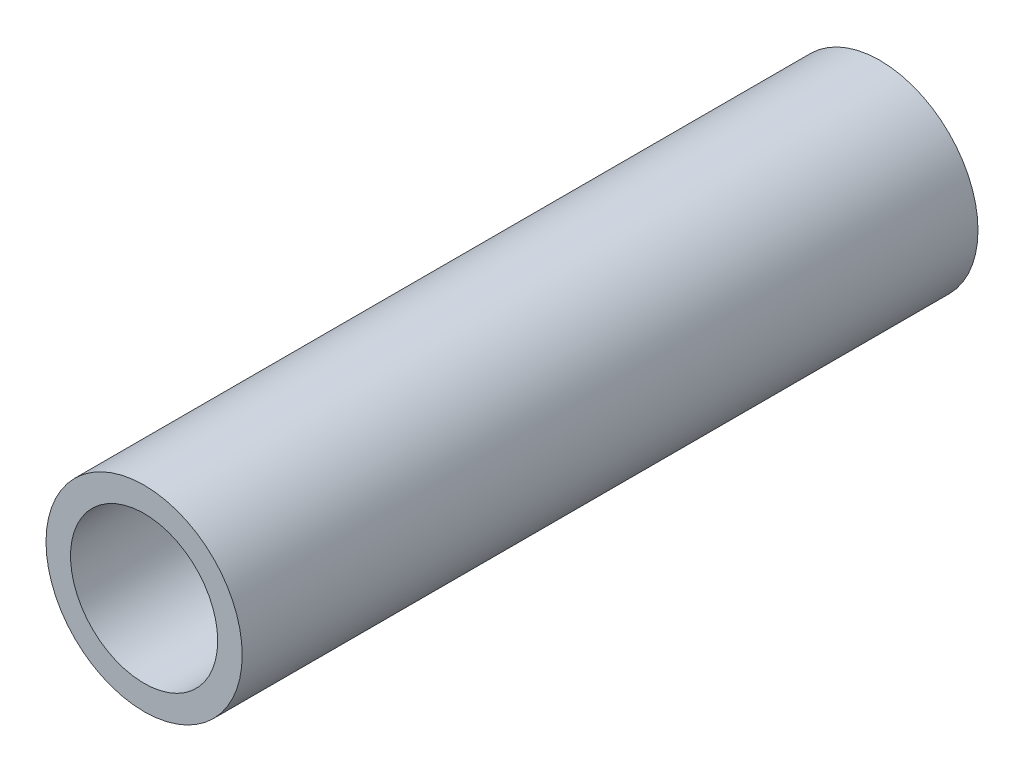
ISO-10303-21;
HEADER;
FILE_DESCRIPTION(('STEP AP214'),'2;1');
FILE_NAME('part.step','',(''),(''),'','','');
FILE_SCHEMA(('AUTOMOTIVE_DESIGN { 1 0 10303 214 1 1 1 1 }'));
ENDSEC;
DATA;
#1=APPLICATION_CONTEXT('core data for automotive mechanical design processes');
#2=APPLICATION_PROTOCOL_DEFINITION('international standard','automotive_design',2000,#1);
#3=PRODUCT_CONTEXT('',#1,'mechanical');
#4=PRODUCT('Part','Part','',(#3));
#5=PRODUCT_RELATED_PRODUCT_CATEGORY('part','',(#4));
#6=PRODUCT_DEFINITION_FORMATION('','',#4);
#7=PRODUCT_DEFINITION_CONTEXT('part definition',#1,'design');
#8=PRODUCT_DEFINITION('design','',#6,#7);
#9=PRODUCT_DEFINITION_SHAPE('','',#8);
#10=(LENGTH_UNIT() NAMED_UNIT(*) SI_UNIT(.MILLI.,.METRE.));
#11=(NAMED_UNIT(*) PLANE_ANGLE_UNIT() SI_UNIT($,.RADIAN.));
#12=(NAMED_UNIT(*) SI_UNIT($,.STERADIAN.) SOLID_ANGLE_UNIT());
#13=UNCERTAINTY_MEASURE_WITH_UNIT(LENGTH_MEASURE(1.E-05),#10,'distance_accuracy_value','');
#14=(GEOMETRIC_REPRESENTATION_CONTEXT(3) GLOBAL_UNCERTAINTY_ASSIGNED_CONTEXT((#13)) GLOBAL_UNIT_ASSIGNED_CONTEXT((#10,
#11,#12)) REPRESENTATION_CONTEXT('',''));
#15=CARTESIAN_POINT('',(0.,0.,0.));
#16=DIRECTION('',(0.,0.,1.));
#17=DIRECTION('',(1.,0.,0.));
#18=AXIS2_PLACEMENT_3D('',#15,#16,#17);
#19=CARTESIAN_POINT('',(0.,0.,30.));
#20=DIRECTION('',(0.,0.,-1.));
#21=DIRECTION('',(-1.,0.,0.));
#22=AXIS2_PLACEMENT_3D('',#19,#20,#21);
#23=CYLINDRICAL_SURFACE('',#22,4.);
#24=CARTESIAN_POINT('',(0.,0.,30.));
#25=DIRECTION('',(0.,0.,1.));
#26=DIRECTION('',(1.,0.,0.));
#27=AXIS2_PLACEMENT_3D('',#24,#25,#26);
#28=CIRCLE('',#27,4.);
#29=CARTESIAN_POINT('',(4.,0.,30.));
#30=VERTEX_POINT('',#29);
#31=EDGE_CURVE('E10',#30,#30,#28,.T.);
#32=ORIENTED_EDGE('',*,*,#31,.F.);
#33=EDGE_LOOP('',(#32));
#34=FACE_BOUND('',#33,.T.);
#35=CARTESIAN_POINT('',(0.,0.,0.));
#36=DIRECTION('',(0.,0.,1.));
#37=DIRECTION('',(1.,0.,0.));
#38=AXIS2_PLACEMENT_3D('',#35,#36,#37);
#39=CIRCLE('',#38,4.);
#40=CARTESIAN_POINT('',(4.,0.,0.));
#41=VERTEX_POINT('',#40);
#42=EDGE_CURVE('E40',#41,#41,#39,.T.);
#43=ORIENTED_EDGE('',*,*,#42,.T.);
#44=EDGE_LOOP('',(#43));
#45=FACE_BOUND('',#44,.T.);
#46=ADVANCED_FACE('F37',(#34,#45),#23,.T.);
#47=CARTESIAN_POINT('',(0.,0.,30.));
#48=DIRECTION('',(0.,0.,1.));
#49=DIRECTION('',(1.,0.,0.));
#50=AXIS2_PLACEMENT_3D('',#47,#48,#49);
#51=PLANE('',#50);
#52=CARTESIAN_POINT('',(0.,0.,30.));
#53=DIRECTION('',(0.,0.,1.));
#54=DIRECTION('',(1.,0.,0.));
#55=AXIS2_PLACEMENT_3D('',#52,#53,#54);
#56=CIRCLE('',#55,3.);
#57=CARTESIAN_POINT('',(3.,0.,30.));
#58=VERTEX_POINT('',#57);
#59=EDGE_CURVE('E47',#58,#58,#56,.T.);
#60=ORIENTED_EDGE('',*,*,#59,.F.);
#61=EDGE_LOOP('',(#60));
#62=FACE_BOUND('',#61,.T.);
#63=ORIENTED_EDGE('',*,*,#31,.T.);
#64=EDGE_LOOP('',(#63));
#65=FACE_BOUND('',#64,.T.);
#66=ADVANCED_FACE('F58',(#62,#65),#51,.T.);
#67=CARTESIAN_POINT('',(0.,0.,0.));
#68=DIRECTION('',(0.,0.,1.));
#69=DIRECTION('',(1.,0.,0.));
#70=AXIS2_PLACEMENT_3D('',#67,#68,#69);
#71=PLANE('',#70);
#72=CARTESIAN_POINT('',(0.,0.,0.));
#73=DIRECTION('',(0.,0.,1.));
#74=DIRECTION('',(1.,0.,0.));
#75=AXIS2_PLACEMENT_3D('',#72,#73,#74);
#76=CIRCLE('',#75,3.);
#77=CARTESIAN_POINT('',(3.,0.,0.));
#78=VERTEX_POINT('',#77);
#79=EDGE_CURVE('E49',#78,#78,#76,.T.);
#80=ORIENTED_EDGE('',*,*,#79,.T.);
#81=EDGE_LOOP('',(#80));
#82=FACE_BOUND('',#81,.T.);
#83=ORIENTED_EDGE('',*,*,#42,.F.);
#84=EDGE_LOOP('',(#83));
#85=FACE_BOUND('',#84,.T.);
#86=ADVANCED_FACE('F60',(#82,#85),#71,.F.);
#87=CARTESIAN_POINT('',(0.,0.,30.));
#88=DIRECTION('',(0.,0.,-1.));
#89=DIRECTION('',(-1.,0.,0.));
#90=AXIS2_PLACEMENT_3D('',#87,#88,#89);
#91=CYLINDRICAL_SURFACE('',#90,3.);
#92=ORIENTED_EDGE('',*,*,#59,.T.);
#93=EDGE_LOOP('',(#92));
#94=FACE_BOUND('',#93,.T.);
#95=ORIENTED_EDGE('',*,*,#79,.F.);
#96=EDGE_LOOP('',(#95));
#97=FACE_BOUND('',#96,.T.);
#98=ADVANCED_FACE('F55',(#94,#97),#91,.F.);
#99=CLOSED_SHELL('',(#46,#66,#86,#98));
#100=MANIFOLD_SOLID_BREP('B2',#99);
#101=ADVANCED_BREP_SHAPE_REPRESENTATION('',(#18,#100),#14);
#102=SHAPE_DEFINITION_REPRESENTATION(#9,#101);
ENDSEC;
END-ISO-10303-21;
